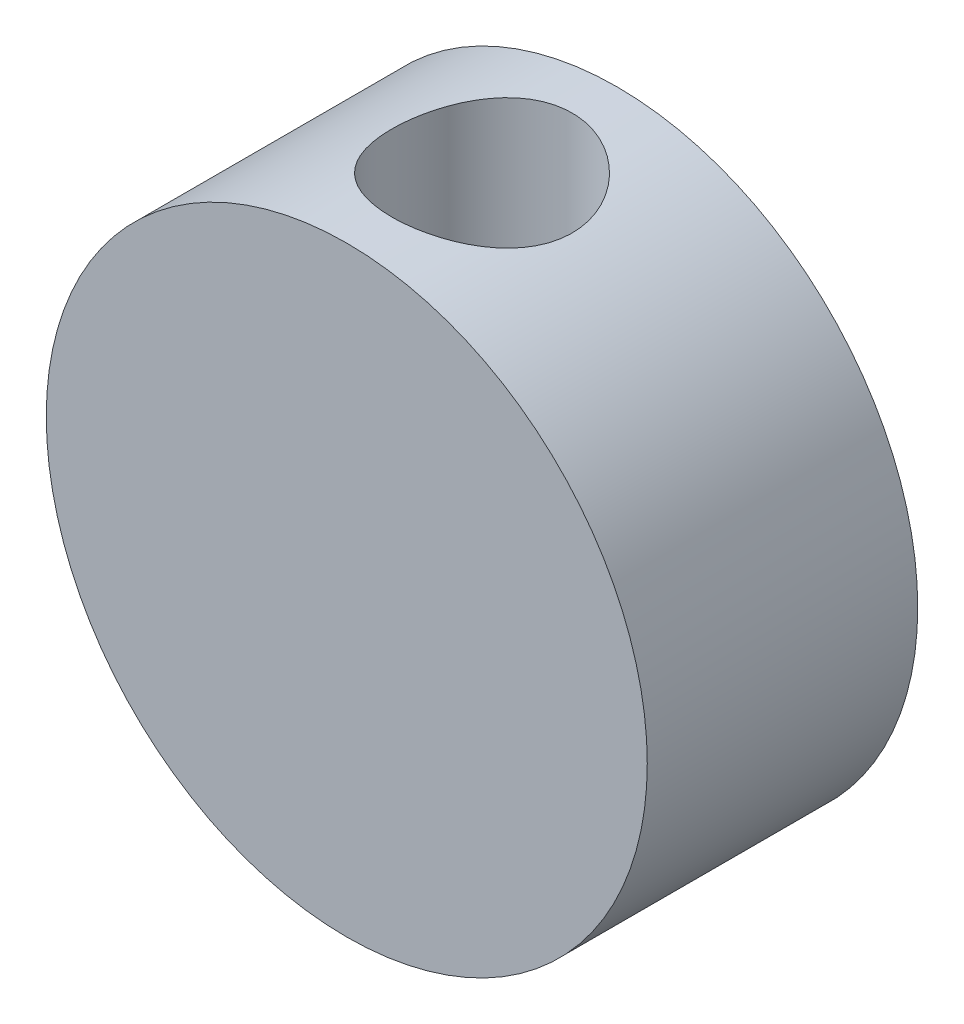
ISO-10303-21;
HEADER;
FILE_DESCRIPTION(('STEP AP214'),'2;1');
FILE_NAME('part.step','',(''),(''),'','','');
FILE_SCHEMA(('AUTOMOTIVE_DESIGN { 1 0 10303 214 1 1 1 1 }'));
ENDSEC;
DATA;
#1=APPLICATION_CONTEXT('core data for automotive mechanical design processes');
#2=APPLICATION_PROTOCOL_DEFINITION('international standard','automotive_design',2000,#1);
#3=PRODUCT_CONTEXT('',#1,'mechanical');
#4=PRODUCT('Part','Part','',(#3));
#5=PRODUCT_RELATED_PRODUCT_CATEGORY('part','',(#4));
#6=PRODUCT_DEFINITION_FORMATION('','',#4);
#7=PRODUCT_DEFINITION_CONTEXT('part definition',#1,'design');
#8=PRODUCT_DEFINITION('design','',#6,#7);
#9=PRODUCT_DEFINITION_SHAPE('','',#8);
#10=(LENGTH_UNIT() NAMED_UNIT(*) SI_UNIT(.MILLI.,.METRE.));
#11=(NAMED_UNIT(*) PLANE_ANGLE_UNIT() SI_UNIT($,.RADIAN.));
#12=(NAMED_UNIT(*) SI_UNIT($,.STERADIAN.) SOLID_ANGLE_UNIT());
#13=UNCERTAINTY_MEASURE_WITH_UNIT(LENGTH_MEASURE(1.E-05),#10,'distance_accuracy_value','');
#14=(GEOMETRIC_REPRESENTATION_CONTEXT(3) GLOBAL_UNCERTAINTY_ASSIGNED_CONTEXT((#13)) GLOBAL_UNIT_ASSIGNED_CONTEXT((#10,
#11,#12)) REPRESENTATION_CONTEXT('',''));
#15=CARTESIAN_POINT('',(0.,0.,0.));
#16=DIRECTION('',(0.,0.,1.));
#17=DIRECTION('',(1.,0.,0.));
#18=AXIS2_PLACEMENT_3D('',#15,#16,#17);
#19=CARTESIAN_POINT('',(0.,0.,4.5));
#20=DIRECTION('',(0.,0.,-1.));
#21=DIRECTION('',(-1.,0.,0.));
#22=AXIS2_PLACEMENT_3D('',#19,#20,#21);
#23=CYLINDRICAL_SURFACE('',#22,5.);
#24=CARTESIAN_POINT('',(0.,-5.,3.75));
#25=CARTESIAN_POINT('',(0.0822886127532999,-4.9999992925055,3.74999900251511));
#26=CARTESIAN_POINT('',(0.164587318351529,-4.99794915693954,3.74320613637603));
#27=CARTESIAN_POINT('',(0.326788125304881,-4.98997105593691,3.7162786457779));
#28=CARTESIAN_POINT('',(0.40668950441142,-4.98404193389692,3.69614004197666));
#29=CARTESIAN_POINT('',(0.561732707754527,-4.96895552501836,3.64325398308974));
#30=CARTESIAN_POINT('',(0.636881364395373,-4.95980300250425,3.61052513038106));
#31=CARTESIAN_POINT('',(0.780624181053132,-4.93922109237645,3.53346390694416));
#32=CARTESIAN_POINT('',(0.84921746746967,-4.92779140192067,3.48912999260458));
#33=CARTESIAN_POINT('',(0.979871797183745,-4.90350737192774,3.38877599252733));
#34=CARTESIAN_POINT('',(1.04171807124434,-4.89062383657036,3.33248337411409));
#35=CARTESIAN_POINT('',(1.15524920923324,-4.86505834210442,3.21039077008982));
#36=CARTESIAN_POINT('',(1.20693236327441,-4.85237641724501,3.14458918787504));
#37=CARTESIAN_POINT('',(1.29980037723708,-4.82834113993772,3.00352924696239));
#38=CARTESIAN_POINT('',(1.34072309022213,-4.81702406663875,2.92809153900926));
#39=CARTESIAN_POINT('',(1.4092139477476,-4.79743620394031,2.77101074576971));
#40=CARTESIAN_POINT('',(1.43678529919973,-4.78916468313311,2.68936915607202));
#41=CARTESIAN_POINT('',(1.47701633682652,-4.77690870838434,2.52460973386954));
#42=CARTESIAN_POINT('',(1.49007196234677,-4.77281069324533,2.44159725613606));
#43=CARTESIAN_POINT('',(1.50213730614672,-4.76902789749767,2.27446684378323));
#44=CARTESIAN_POINT('',(1.50115042761078,-4.76934204760571,2.19034918194091));
#45=CARTESIAN_POINT('',(1.48546977199812,-4.77424744067778,2.02661609139152));
#46=CARTESIAN_POINT('',(1.47127205262685,-4.7786838859914,1.94694774963776));
#47=CARTESIAN_POINT('',(1.43037420427056,-4.79108356228624,1.79118021372654));
#48=CARTESIAN_POINT('',(1.40367284141641,-4.79904714132351,1.71508137262567));
#49=CARTESIAN_POINT('',(1.33816026653682,-4.81772733074973,1.56739965033926));
#50=CARTESIAN_POINT('',(1.29918816934642,-4.82848016115952,1.49589291604474));
#51=CARTESIAN_POINT('',(1.21035222588683,-4.85150987000065,1.36026797798981));
#52=CARTESIAN_POINT('',(1.16048574002588,-4.86378711746991,1.29615157058622));
#53=CARTESIAN_POINT('',(1.04881290765546,-4.88911011297937,1.17431380923798));
#54=CARTESIAN_POINT('',(0.986594907466972,-4.90216654310498,1.11697133597033));
#55=CARTESIAN_POINT('',(0.853263259313967,-4.92712244063259,1.01344601593575));
#56=CARTESIAN_POINT('',(0.782149051860888,-4.9390218351841,0.967263871585573));
#57=CARTESIAN_POINT('',(0.632355038342803,-4.9604316006947,0.887140077535269));
#58=CARTESIAN_POINT('',(0.55362774974795,-4.96992543668314,0.853282483750138));
#59=CARTESIAN_POINT('',(0.391245415603519,-4.98533521832222,0.799400409900369));
#60=CARTESIAN_POINT('',(0.307591751589581,-4.99125216186999,0.77937207146751));
#61=CARTESIAN_POINT('',(0.140952242668331,-4.99868364643538,0.754347822100605));
#62=CARTESIAN_POINT('',(0.0580500976011866,-5.0003485041779,0.748838414198389));
#63=CARTESIAN_POINT('',(-0.107499605823383,-4.9995292324176,0.75156915571208));
#64=CARTESIAN_POINT('',(-0.190147196690781,-4.99704565677756,0.759807469651442));
#65=CARTESIAN_POINT('',(-0.350903605309697,-4.98830696987163,0.789384611111496));
#66=CARTESIAN_POINT('',(-0.42907277261417,-4.98213829799417,0.810423387580869));
#67=CARTESIAN_POINT('',(-0.580754638954522,-4.96674347841533,0.864643232778201));
#68=CARTESIAN_POINT('',(-0.654266777025584,-4.95751696321085,0.897825761037862));
#69=CARTESIAN_POINT('',(-0.796437189461053,-4.93669654351325,0.976253165481131));
#70=CARTESIAN_POINT('',(-0.86494382619967,-4.92505280829675,1.02175934094797));
#71=CARTESIAN_POINT('',(-0.993523307980147,-4.90073468764318,1.12322475405281));
#72=CARTESIAN_POINT('',(-1.05359403235593,-4.8880600443108,1.17918661188767));
#73=CARTESIAN_POINT('',(-1.16585744551027,-4.86253171869138,1.30238730836935));
#74=CARTESIAN_POINT('',(-1.21768481231504,-4.84968825033268,1.36996187577174));
#75=CARTESIAN_POINT('',(-1.30928995072154,-4.82576515238463,1.51312793901353));
#76=CARTESIAN_POINT('',(-1.34906803829472,-4.81468547654651,1.58871922455821));
#77=CARTESIAN_POINT('',(-1.41517347127168,-4.79567189615055,1.74553249125469));
#78=CARTESIAN_POINT('',(-1.4415634693705,-4.78772337843827,1.82672618653659));
#79=CARTESIAN_POINT('',(-1.48021730815114,-4.77591594362794,1.99268796893148));
#80=CARTESIAN_POINT('',(-1.49248598978779,-4.772055625083,2.07745482078767));
#81=CARTESIAN_POINT('',(-1.50221984485059,-4.76899972496087,2.24436151837623));
#82=CARTESIAN_POINT('',(-1.5002805530849,-4.76961647442754,2.32646365101759));
#83=CARTESIAN_POINT('',(-1.48307505444813,-4.77499401288294,2.4891141033728));
#84=CARTESIAN_POINT('',(-1.46780938124716,-4.77975463592551,2.56966248517635));
#85=CARTESIAN_POINT('',(-1.42476888804136,-4.79275763670385,2.72594539914285));
#86=CARTESIAN_POINT('',(-1.39715175507068,-4.80095604545965,2.80172728736169));
#87=CARTESIAN_POINT('',(-1.33031507121129,-4.81990278909136,2.94764243881772));
#88=CARTESIAN_POINT('',(-1.29109329962876,-4.83065161194312,3.01777461764076));
#89=CARTESIAN_POINT('',(-1.20048763805072,-4.85397676425833,3.15316311652711));
#90=CARTESIAN_POINT('',(-1.14871276092994,-4.86660540163798,3.21814876126041));
#91=CARTESIAN_POINT('',(-1.03517434629782,-4.89201320450026,3.33870249830786));
#92=CARTESIAN_POINT('',(-0.973408217134501,-4.90479240823905,3.39426813946776));
#93=CARTESIAN_POINT('',(-0.839465762183248,-4.92950936570649,3.49602341229503));
#94=CARTESIAN_POINT('',(-0.767037885790607,-4.94141159765674,3.54189144685549));
#95=CARTESIAN_POINT('',(-0.615141373983528,-4.96260680455813,3.62073516990403));
#96=CARTESIAN_POINT('',(-0.535676052998954,-4.97190099931066,3.65371688827451));
#97=CARTESIAN_POINT('',(-0.38075771265528,-4.98602174969301,3.70289527565275));
#98=CARTESIAN_POINT('',(-0.305786961954233,-4.99122027381068,3.72051167288325));
#99=CARTESIAN_POINT('',(-0.153880195230778,-4.99820944494492,3.74406352524158));
#100=CARTESIAN_POINT('',(-0.0769445098581391,-5.0000006615474,3.75000093270482));
#101=CARTESIAN_POINT('',(0.,-5.,3.75));
#102=B_SPLINE_CURVE_WITH_KNOTS('',3,(#24,#25,#26,#27,#28,#29,#30,#31,#32,#33,#34,#35,#36,#37,
#38,#39,#40,#41,#42,#43,#44,#45,#46,#47,#48,#49,#50,#51,#52,#53,#54,#55,#56,#57,#58,#59,#60,#61,
#62,#63,#64,#65,#66,#67,#68,#69,#70,#71,#72,#73,#74,#75,#76,#77,#78,#79,#80,#81,#82,#83,#84,#85,
#86,#87,#88,#89,#90,#91,#92,#93,#94,#95,#96,#97,#98,#99,#100,#101),.UNSPECIFIED.,.T.,.F.,(4,2,2,
2,2,2,2,2,2,2,2,2,2,2,2,2,2,2,2,2,2,2,2,2,2,2,2,2,2,2,2,2,2,2,2,2,2,2,4),(0.,0.246583203612611,
0.493239964846,0.739533676300874,0.985860164412702,1.23855602948191,1.49129437288633,
1.74971481004109,2.00807314543224,2.25919689356599,2.51025978319089,2.75226016697676,
2.99428443658001,3.23962426447119,3.48502360158555,3.74067104048167,3.99633456531071,
4.25371046881689,4.51101453528808,4.75908809438545,5.00712853550327,5.24956746682327,
5.49203554593729,5.74011305702908,5.98825282000191,6.24540400322818,6.5025484425268,
6.75847814951252,7.01432009460283,7.25950155466943,7.504673196616,7.74680040402721,
7.98897397553107,8.23996925679931,8.49102974897502,8.74942996156671,9.00770911595235,
9.23831691930459,9.46888616948874),.UNSPECIFIED.);
#103=CARTESIAN_POINT('',(0.,-5.,3.75));
#104=VERTEX_POINT('',#103);
#105=EDGE_CURVE('E10',#104,#104,#102,.T.);
#106=ORIENTED_EDGE('',*,*,#105,.T.);
#107=EDGE_LOOP('',(#106));
#108=FACE_BOUND('',#107,.T.);
#109=CARTESIAN_POINT('',(0.,5.,3.75));
#110=CARTESIAN_POINT('',(-0.0822886127532999,4.9999992925055,3.74999900251511));
#111=CARTESIAN_POINT('',(-0.164587318351529,4.99794915693954,3.74320613637603));
#112=CARTESIAN_POINT('',(-0.326788125304881,4.98997105593691,3.7162786457779));
#113=CARTESIAN_POINT('',(-0.40668950441142,4.98404193389692,3.69614004197666));
#114=CARTESIAN_POINT('',(-0.561732707754527,4.96895552501836,3.64325398308974));
#115=CARTESIAN_POINT('',(-0.636881364395373,4.95980300250425,3.61052513038106));
#116=CARTESIAN_POINT('',(-0.780624181053132,4.93922109237645,3.53346390694416));
#117=CARTESIAN_POINT('',(-0.84921746746967,4.92779140192067,3.48912999260458));
#118=CARTESIAN_POINT('',(-0.979871797183745,4.90350737192774,3.38877599252733));
#119=CARTESIAN_POINT('',(-1.04171807124434,4.89062383657036,3.33248337411409));
#120=CARTESIAN_POINT('',(-1.15524920923324,4.86505834210442,3.21039077008982));
#121=CARTESIAN_POINT('',(-1.20693236327441,4.85237641724501,3.14458918787504));
#122=CARTESIAN_POINT('',(-1.29980037723708,4.82834113993772,3.00352924696239));
#123=CARTESIAN_POINT('',(-1.34072309022213,4.81702406663875,2.92809153900926));
#124=CARTESIAN_POINT('',(-1.4092139477476,4.79743620394031,2.77101074576971));
#125=CARTESIAN_POINT('',(-1.43678529919973,4.78916468313311,2.68936915607202));
#126=CARTESIAN_POINT('',(-1.47701633682652,4.77690870838434,2.52460973386954));
#127=CARTESIAN_POINT('',(-1.49007196234677,4.77281069324533,2.44159725613606));
#128=CARTESIAN_POINT('',(-1.50213730614672,4.76902789749767,2.27446684378323));
#129=CARTESIAN_POINT('',(-1.50115042761078,4.76934204760571,2.19034918194091));
#130=CARTESIAN_POINT('',(-1.48546977199812,4.77424744067778,2.02661609139152));
#131=CARTESIAN_POINT('',(-1.47127205262685,4.7786838859914,1.94694774963776));
#132=CARTESIAN_POINT('',(-1.43037420427056,4.79108356228624,1.79118021372654));
#133=CARTESIAN_POINT('',(-1.40367284141641,4.79904714132351,1.71508137262567));
#134=CARTESIAN_POINT('',(-1.33816026653682,4.81772733074973,1.56739965033926));
#135=CARTESIAN_POINT('',(-1.29918816934642,4.82848016115952,1.49589291604474));
#136=CARTESIAN_POINT('',(-1.21035222588683,4.85150987000065,1.36026797798981));
#137=CARTESIAN_POINT('',(-1.16048574002588,4.86378711746991,1.29615157058622));
#138=CARTESIAN_POINT('',(-1.04881290765546,4.88911011297937,1.17431380923798));
#139=CARTESIAN_POINT('',(-0.986594907466972,4.90216654310498,1.11697133597033));
#140=CARTESIAN_POINT('',(-0.853263259313967,4.92712244063259,1.01344601593575));
#141=CARTESIAN_POINT('',(-0.782149051860888,4.9390218351841,0.967263871585573));
#142=CARTESIAN_POINT('',(-0.632355038342803,4.9604316006947,0.887140077535269));
#143=CARTESIAN_POINT('',(-0.55362774974795,4.96992543668314,0.853282483750138));
#144=CARTESIAN_POINT('',(-0.391245415603519,4.98533521832222,0.799400409900369));
#145=CARTESIAN_POINT('',(-0.307591751589581,4.99125216186999,0.77937207146751));
#146=CARTESIAN_POINT('',(-0.140952242668331,4.99868364643538,0.754347822100605));
#147=CARTESIAN_POINT('',(-0.0580500976011866,5.0003485041779,0.748838414198389));
#148=CARTESIAN_POINT('',(0.107499605823383,4.9995292324176,0.75156915571208));
#149=CARTESIAN_POINT('',(0.190147196690781,4.99704565677756,0.759807469651442));
#150=CARTESIAN_POINT('',(0.350903605309697,4.98830696987163,0.789384611111496));
#151=CARTESIAN_POINT('',(0.42907277261417,4.98213829799417,0.810423387580869));
#152=CARTESIAN_POINT('',(0.580754638954522,4.96674347841533,0.864643232778201));
#153=CARTESIAN_POINT('',(0.654266777025584,4.95751696321085,0.897825761037862));
#154=CARTESIAN_POINT('',(0.796437189461053,4.93669654351325,0.976253165481131));
#155=CARTESIAN_POINT('',(0.86494382619967,4.92505280829675,1.02175934094797));
#156=CARTESIAN_POINT('',(0.993523307980147,4.90073468764318,1.12322475405281));
#157=CARTESIAN_POINT('',(1.05359403235593,4.8880600443108,1.17918661188767));
#158=CARTESIAN_POINT('',(1.16585744551027,4.86253171869138,1.30238730836935));
#159=CARTESIAN_POINT('',(1.21768481231504,4.84968825033268,1.36996187577174));
#160=CARTESIAN_POINT('',(1.30928995072154,4.82576515238463,1.51312793901353));
#161=CARTESIAN_POINT('',(1.34906803829472,4.81468547654651,1.58871922455821));
#162=CARTESIAN_POINT('',(1.41517347127168,4.79567189615055,1.74553249125469));
#163=CARTESIAN_POINT('',(1.4415634693705,4.78772337843827,1.82672618653659));
#164=CARTESIAN_POINT('',(1.48021730815114,4.77591594362794,1.99268796893148));
#165=CARTESIAN_POINT('',(1.49248598978779,4.772055625083,2.07745482078767));
#166=CARTESIAN_POINT('',(1.50221984485059,4.76899972496087,2.24436151837623));
#167=CARTESIAN_POINT('',(1.5002805530849,4.76961647442754,2.32646365101759));
#168=CARTESIAN_POINT('',(1.48307505444813,4.77499401288294,2.4891141033728));
#169=CARTESIAN_POINT('',(1.46780938124716,4.77975463592551,2.56966248517635));
#170=CARTESIAN_POINT('',(1.42476888804136,4.79275763670385,2.72594539914285));
#171=CARTESIAN_POINT('',(1.39715175507068,4.80095604545965,2.80172728736169));
#172=CARTESIAN_POINT('',(1.33031507121129,4.81990278909136,2.94764243881772));
#173=CARTESIAN_POINT('',(1.29109329962876,4.83065161194312,3.01777461764076));
#174=CARTESIAN_POINT('',(1.20048763805072,4.85397676425833,3.15316311652711));
#175=CARTESIAN_POINT('',(1.14871276092994,4.86660540163798,3.21814876126041));
#176=CARTESIAN_POINT('',(1.03517434629782,4.89201320450026,3.33870249830786));
#177=CARTESIAN_POINT('',(0.973408217134501,4.90479240823905,3.39426813946776));
#178=CARTESIAN_POINT('',(0.839465762183248,4.92950936570649,3.49602341229503));
#179=CARTESIAN_POINT('',(0.767037885790607,4.94141159765674,3.54189144685549));
#180=CARTESIAN_POINT('',(0.615141373983528,4.96260680455813,3.62073516990403));
#181=CARTESIAN_POINT('',(0.535676052998954,4.97190099931066,3.65371688827451));
#182=CARTESIAN_POINT('',(0.38075771265528,4.98602174969301,3.70289527565275));
#183=CARTESIAN_POINT('',(0.305786961954233,4.99122027381068,3.72051167288325));
#184=CARTESIAN_POINT('',(0.153880195230778,4.99820944494492,3.74406352524158));
#185=CARTESIAN_POINT('',(0.0769445098581391,5.0000006615474,3.75000093270482));
#186=CARTESIAN_POINT('',(0.,5.,3.75));
#187=B_SPLINE_CURVE_WITH_KNOTS('',3,(#109,#110,#111,#112,#113,#114,#115,#116,#117,#118,#119,
#120,#121,#122,#123,#124,#125,#126,#127,#128,#129,#130,#131,#132,#133,#134,#135,#136,#137,#138,
#139,#140,#141,#142,#143,#144,#145,#146,#147,#148,#149,#150,#151,#152,#153,#154,#155,#156,#157,
#158,#159,#160,#161,#162,#163,#164,#165,#166,#167,#168,#169,#170,#171,#172,#173,#174,#175,#176,
#177,#178,#179,#180,#181,#182,#183,#184,#185,#186),.UNSPECIFIED.,.T.,.F.,(4,2,2,2,2,2,2,2,2,2,2,
2,2,2,2,2,2,2,2,2,2,2,2,2,2,2,2,2,2,2,2,2,2,2,2,2,2,2,4),(0.,0.246583203612611,0.493239964846,
0.739533676300874,0.985860164412702,1.23855602948191,1.49129437288633,1.74971481004109,
2.00807314543224,2.25919689356599,2.51025978319089,2.75226016697676,2.99428443658001,
3.23962426447119,3.48502360158555,3.74067104048167,3.99633456531071,4.25371046881689,
4.51101453528808,4.75908809438545,5.00712853550327,5.24956746682327,5.49203554593729,
5.74011305702908,5.98825282000191,6.24540400322818,6.5025484425268,6.75847814951252,
7.01432009460283,7.25950155466943,7.504673196616,7.74680040402721,7.98897397553107,
8.23996925679931,8.49102974897502,8.74942996156671,9.00770911595235,9.23831691930459,
9.46888616948874),.UNSPECIFIED.);
#188=CARTESIAN_POINT('',(0.,5.,3.75));
#189=VERTEX_POINT('',#188);
#190=EDGE_CURVE('E41',#189,#189,#187,.T.);
#191=ORIENTED_EDGE('',*,*,#190,.T.);
#192=EDGE_LOOP('',(#191));
#193=FACE_BOUND('',#192,.T.);
#194=CARTESIAN_POINT('',(0.,0.,4.5));
#195=DIRECTION('',(0.,0.,1.));
#196=DIRECTION('',(1.,0.,0.));
#197=AXIS2_PLACEMENT_3D('',#194,#195,#196);
#198=CIRCLE('',#197,5.);
#199=CARTESIAN_POINT('',(5.,0.,4.5));
#200=VERTEX_POINT('',#199);
#201=EDGE_CURVE('E45',#200,#200,#198,.T.);
#202=ORIENTED_EDGE('',*,*,#201,.F.);
#203=EDGE_LOOP('',(#202));
#204=FACE_BOUND('',#203,.T.);
#205=CARTESIAN_POINT('',(0.,0.,0.));
#206=DIRECTION('',(0.,0.,1.));
#207=DIRECTION('',(1.,0.,0.));
#208=AXIS2_PLACEMENT_3D('',#205,#206,#207);
#209=CIRCLE('',#208,5.);
#210=CARTESIAN_POINT('',(5.,0.,0.));
#211=VERTEX_POINT('',#210);
#212=EDGE_CURVE('E49',#211,#211,#209,.T.);
#213=ORIENTED_EDGE('',*,*,#212,.T.);
#214=EDGE_LOOP('',(#213));
#215=FACE_BOUND('',#214,.T.);
#216=ADVANCED_FACE('F31',(#108,#193,#204,#215),#23,.T.);
#217=CARTESIAN_POINT('',(0.,0.,4.5));
#218=DIRECTION('',(0.,0.,1.));
#219=DIRECTION('',(1.,0.,0.));
#220=AXIS2_PLACEMENT_3D('',#217,#218,#219);
#221=PLANE('',#220);
#222=ORIENTED_EDGE('',*,*,#201,.T.);
#223=EDGE_LOOP('',(#222));
#224=FACE_BOUND('',#223,.T.);
#225=ADVANCED_FACE('F60',(#224),#221,.T.);
#226=CARTESIAN_POINT('',(0.,0.,0.));
#227=DIRECTION('',(0.,0.,1.));
#228=DIRECTION('',(1.,0.,0.));
#229=AXIS2_PLACEMENT_3D('',#226,#227,#228);
#230=PLANE('',#229);
#231=ORIENTED_EDGE('',*,*,#212,.F.);
#232=EDGE_LOOP('',(#231));
#233=FACE_BOUND('',#232,.T.);
#234=ADVANCED_FACE('F58',(#233),#230,.F.);
#235=CARTESIAN_POINT('',(0.,-5.,2.25));
#236=DIRECTION('',(0.,1.,0.));
#237=DIRECTION('',(0.,0.,1.));
#238=AXIS2_PLACEMENT_3D('',#235,#236,#237);
#239=CYLINDRICAL_SURFACE('',#238,1.5);
#240=ORIENTED_EDGE('',*,*,#190,.F.);
#241=EDGE_LOOP('',(#240));
#242=FACE_BOUND('',#241,.T.);
#243=ORIENTED_EDGE('',*,*,#105,.F.);
#244=EDGE_LOOP('',(#243));
#245=FACE_BOUND('',#244,.T.);
#246=ADVANCED_FACE('F54',(#242,#245),#239,.F.);
#247=CLOSED_SHELL('',(#216,#225,#234,#246));
#248=MANIFOLD_SOLID_BREP('B2',#247);
#249=ADVANCED_BREP_SHAPE_REPRESENTATION('',(#18,#248),#14);
#250=SHAPE_DEFINITION_REPRESENTATION(#9,#249);
ENDSEC;
END-ISO-10303-21;
